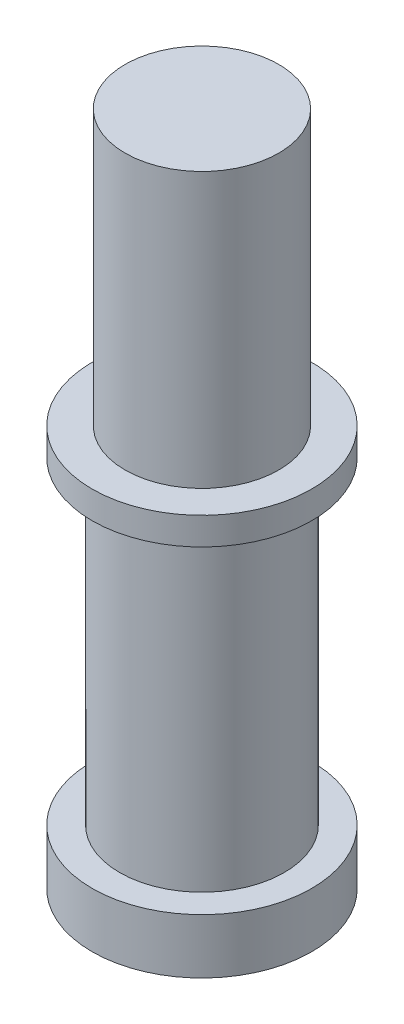
ISO-10303-21;
HEADER;
FILE_DESCRIPTION(('STEP AP214'),'2;1');
FILE_NAME('part.step','',(''),(''),'','','');
FILE_SCHEMA(('AUTOMOTIVE_DESIGN { 1 0 10303 214 1 1 1 1 }'));
ENDSEC;
DATA;
#1=APPLICATION_CONTEXT('core data for automotive mechanical design processes');
#2=APPLICATION_PROTOCOL_DEFINITION('international standard','automotive_design',2000,#1);
#3=PRODUCT_CONTEXT('',#1,'mechanical');
#4=PRODUCT('Part','Part','',(#3));
#5=PRODUCT_RELATED_PRODUCT_CATEGORY('part','',(#4));
#6=PRODUCT_DEFINITION_FORMATION('','',#4);
#7=PRODUCT_DEFINITION_CONTEXT('part definition',#1,'design');
#8=PRODUCT_DEFINITION('design','',#6,#7);
#9=PRODUCT_DEFINITION_SHAPE('','',#8);
#10=(LENGTH_UNIT() NAMED_UNIT(*) SI_UNIT(.MILLI.,.METRE.));
#11=(NAMED_UNIT(*) PLANE_ANGLE_UNIT() SI_UNIT($,.RADIAN.));
#12=(NAMED_UNIT(*) SI_UNIT($,.STERADIAN.) SOLID_ANGLE_UNIT());
#13=UNCERTAINTY_MEASURE_WITH_UNIT(LENGTH_MEASURE(1.E-05),#10,'distance_accuracy_value','');
#14=(GEOMETRIC_REPRESENTATION_CONTEXT(3) GLOBAL_UNCERTAINTY_ASSIGNED_CONTEXT((#13)) GLOBAL_UNIT_ASSIGNED_CONTEXT((#10,
#11,#12)) REPRESENTATION_CONTEXT('',''));
#15=CARTESIAN_POINT('',(0.,0.,0.));
#16=DIRECTION('',(0.,0.,1.));
#17=DIRECTION('',(1.,0.,0.));
#18=AXIS2_PLACEMENT_3D('',#15,#16,#17);
#19=CARTESIAN_POINT('',(0.,1.,0.));
#20=DIRECTION('',(0.,-1.,0.));
#21=DIRECTION('',(0.,0.,-1.));
#22=AXIS2_PLACEMENT_3D('',#19,#20,#21);
#23=CYLINDRICAL_SURFACE('',#22,2.);
#24=CARTESIAN_POINT('',(0.,1.,0.));
#25=DIRECTION('',(0.,1.,0.));
#26=DIRECTION('',(0.,0.,1.));
#27=AXIS2_PLACEMENT_3D('',#24,#25,#26);
#28=CIRCLE('',#27,2.);
#29=CARTESIAN_POINT('',(0.,1.,2.));
#30=VERTEX_POINT('',#29);
#31=EDGE_CURVE('E43',#30,#30,#28,.T.);
#32=ORIENTED_EDGE('',*,*,#31,.F.);
#33=EDGE_LOOP('',(#32));
#34=FACE_BOUND('',#33,.T.);
#35=CARTESIAN_POINT('',(0.,0.,0.));
#36=DIRECTION('',(0.,1.,0.));
#37=DIRECTION('',(0.,0.,1.));
#38=AXIS2_PLACEMENT_3D('',#35,#36,#37);
#39=CIRCLE('',#38,2.);
#40=CARTESIAN_POINT('',(0.,0.,2.));
#41=VERTEX_POINT('',#40);
#42=EDGE_CURVE('E34',#41,#41,#39,.T.);
#43=ORIENTED_EDGE('',*,*,#42,.T.);
#44=EDGE_LOOP('',(#43));
#45=FACE_BOUND('',#44,.T.);
#46=ADVANCED_FACE('F31',(#34,#45),#23,.T.);
#47=CARTESIAN_POINT('',(0.,1.,0.));
#48=DIRECTION('',(0.,1.,0.));
#49=DIRECTION('',(0.,0.,1.));
#50=AXIS2_PLACEMENT_3D('',#47,#48,#49);
#51=PLANE('',#50);
#52=CARTESIAN_POINT('',(0.,1.,0.));
#53=DIRECTION('',(0.,1.,0.));
#54=DIRECTION('',(0.,0.,1.));
#55=AXIS2_PLACEMENT_3D('',#52,#53,#54);
#56=CIRCLE('',#55,1.5);
#57=CARTESIAN_POINT('',(0.,1.,1.5));
#58=VERTEX_POINT('',#57);
#59=EDGE_CURVE('E38',#58,#58,#56,.T.);
#60=ORIENTED_EDGE('',*,*,#59,.F.);
#61=EDGE_LOOP('',(#60));
#62=FACE_BOUND('',#61,.T.);
#63=ORIENTED_EDGE('',*,*,#31,.T.);
#64=EDGE_LOOP('',(#63));
#65=FACE_BOUND('',#64,.T.);
#66=ADVANCED_FACE('F66',(#62,#65),#51,.T.);
#67=CARTESIAN_POINT('',(0.,0.,0.));
#68=DIRECTION('',(0.,1.,0.));
#69=DIRECTION('',(0.,0.,1.));
#70=AXIS2_PLACEMENT_3D('',#67,#68,#69);
#71=PLANE('',#70);
#72=ORIENTED_EDGE('',*,*,#42,.F.);
#73=EDGE_LOOP('',(#72));
#74=FACE_BOUND('',#73,.T.);
#75=ADVANCED_FACE('F63',(#74),#71,.F.);
#76=CARTESIAN_POINT('',(0.,6.8,0.));
#77=DIRECTION('',(0.,-1.,0.));
#78=DIRECTION('',(0.,0.,-1.));
#79=AXIS2_PLACEMENT_3D('',#76,#77,#78);
#80=CYLINDRICAL_SURFACE('',#79,1.5);
#81=CARTESIAN_POINT('',(0.,6.8,0.));
#82=DIRECTION('',(0.,1.,0.));
#83=DIRECTION('',(0.,0.,1.));
#84=AXIS2_PLACEMENT_3D('',#81,#82,#83);
#85=CIRCLE('',#84,1.5);
#86=CARTESIAN_POINT('',(0.,6.8,1.5));
#87=VERTEX_POINT('',#86);
#88=EDGE_CURVE('E51',#87,#87,#85,.T.);
#89=ORIENTED_EDGE('',*,*,#88,.F.);
#90=EDGE_LOOP('',(#89));
#91=FACE_BOUND('',#90,.T.);
#92=ORIENTED_EDGE('',*,*,#59,.T.);
#93=EDGE_LOOP('',(#92));
#94=FACE_BOUND('',#93,.T.);
#95=ADVANCED_FACE('F65',(#91,#94),#80,.T.);
#96=CARTESIAN_POINT('',(0.,7.3,0.));
#97=DIRECTION('',(0.,-1.,0.));
#98=DIRECTION('',(0.,0.,-1.));
#99=AXIS2_PLACEMENT_3D('',#96,#97,#98);
#100=CYLINDRICAL_SURFACE('',#99,2.);
#101=CARTESIAN_POINT('',(0.,7.3,0.));
#102=DIRECTION('',(0.,1.,0.));
#103=DIRECTION('',(0.,0.,1.));
#104=AXIS2_PLACEMENT_3D('',#101,#102,#103);
#105=CIRCLE('',#104,2.);
#106=CARTESIAN_POINT('',(0.,7.3,2.));
#107=VERTEX_POINT('',#106);
#108=EDGE_CURVE('E48',#107,#107,#105,.T.);
#109=ORIENTED_EDGE('',*,*,#108,.F.);
#110=EDGE_LOOP('',(#109));
#111=FACE_BOUND('',#110,.T.);
#112=CARTESIAN_POINT('',(0.,6.8,0.));
#113=DIRECTION('',(0.,1.,0.));
#114=DIRECTION('',(0.,0.,1.));
#115=AXIS2_PLACEMENT_3D('',#112,#113,#114);
#116=CIRCLE('',#115,2.);
#117=CARTESIAN_POINT('',(0.,6.8,2.));
#118=VERTEX_POINT('',#117);
#119=EDGE_CURVE('E52',#118,#118,#116,.T.);
#120=ORIENTED_EDGE('',*,*,#119,.T.);
#121=EDGE_LOOP('',(#120));
#122=FACE_BOUND('',#121,.T.);
#123=ADVANCED_FACE('F71',(#111,#122),#100,.T.);
#124=CARTESIAN_POINT('',(0.,7.3,0.));
#125=DIRECTION('',(0.,1.,0.));
#126=DIRECTION('',(0.,0.,1.));
#127=AXIS2_PLACEMENT_3D('',#124,#125,#126);
#128=PLANE('',#127);
#129=CARTESIAN_POINT('',(0.,7.3,0.));
#130=DIRECTION('',(0.,1.,0.));
#131=DIRECTION('',(0.,0.,1.));
#132=AXIS2_PLACEMENT_3D('',#129,#130,#131);
#133=CIRCLE('',#132,1.4);
#134=CARTESIAN_POINT('',(0.,7.3,1.4));
#135=VERTEX_POINT('',#134);
#136=EDGE_CURVE('E10',#135,#135,#133,.T.);
#137=ORIENTED_EDGE('',*,*,#136,.F.);
#138=EDGE_LOOP('',(#137));
#139=FACE_BOUND('',#138,.T.);
#140=ORIENTED_EDGE('',*,*,#108,.T.);
#141=EDGE_LOOP('',(#140));
#142=FACE_BOUND('',#141,.T.);
#143=ADVANCED_FACE('F101',(#139,#142),#128,.T.);
#144=CARTESIAN_POINT('',(0.,6.8,0.));
#145=DIRECTION('',(0.,1.,0.));
#146=DIRECTION('',(0.,0.,1.));
#147=AXIS2_PLACEMENT_3D('',#144,#145,#146);
#148=PLANE('',#147);
#149=ORIENTED_EDGE('',*,*,#88,.T.);
#150=EDGE_LOOP('',(#149));
#151=FACE_BOUND('',#150,.T.);
#152=ORIENTED_EDGE('',*,*,#119,.F.);
#153=EDGE_LOOP('',(#152));
#154=FACE_BOUND('',#153,.T.);
#155=ADVANCED_FACE('F109',(#151,#154),#148,.F.);
#156=CARTESIAN_POINT('',(0.,12.3,0.));
#157=DIRECTION('',(0.,-1.,0.));
#158=DIRECTION('',(0.,0.,-1.));
#159=AXIS2_PLACEMENT_3D('',#156,#157,#158);
#160=CYLINDRICAL_SURFACE('',#159,1.4);
#161=CARTESIAN_POINT('',(0.,12.3,0.));
#162=DIRECTION('',(0.,1.,0.));
#163=DIRECTION('',(0.,0.,1.));
#164=AXIS2_PLACEMENT_3D('',#161,#162,#163);
#165=CIRCLE('',#164,1.4);
#166=CARTESIAN_POINT('',(0.,12.3,1.4));
#167=VERTEX_POINT('',#166);
#168=EDGE_CURVE('E47',#167,#167,#165,.T.);
#169=ORIENTED_EDGE('',*,*,#168,.F.);
#170=EDGE_LOOP('',(#169));
#171=FACE_BOUND('',#170,.T.);
#172=ORIENTED_EDGE('',*,*,#136,.T.);
#173=EDGE_LOOP('',(#172));
#174=FACE_BOUND('',#173,.T.);
#175=ADVANCED_FACE('F114',(#171,#174),#160,.T.);
#176=CARTESIAN_POINT('',(0.,12.3,0.));
#177=DIRECTION('',(0.,1.,0.));
#178=DIRECTION('',(0.,0.,1.));
#179=AXIS2_PLACEMENT_3D('',#176,#177,#178);
#180=PLANE('',#179);
#181=ORIENTED_EDGE('',*,*,#168,.T.);
#182=EDGE_LOOP('',(#181));
#183=FACE_BOUND('',#182,.T.);
#184=ADVANCED_FACE('F131',(#183),#180,.T.);
#185=CLOSED_SHELL('',(#46,#66,#75,#95,#123,#143,#155,#175,#184));
#186=MANIFOLD_SOLID_BREP('B2',#185);
#187=ADVANCED_BREP_SHAPE_REPRESENTATION('',(#18,#186),#14);
#188=SHAPE_DEFINITION_REPRESENTATION(#9,#187);
ENDSEC;
END-ISO-10303-21;
